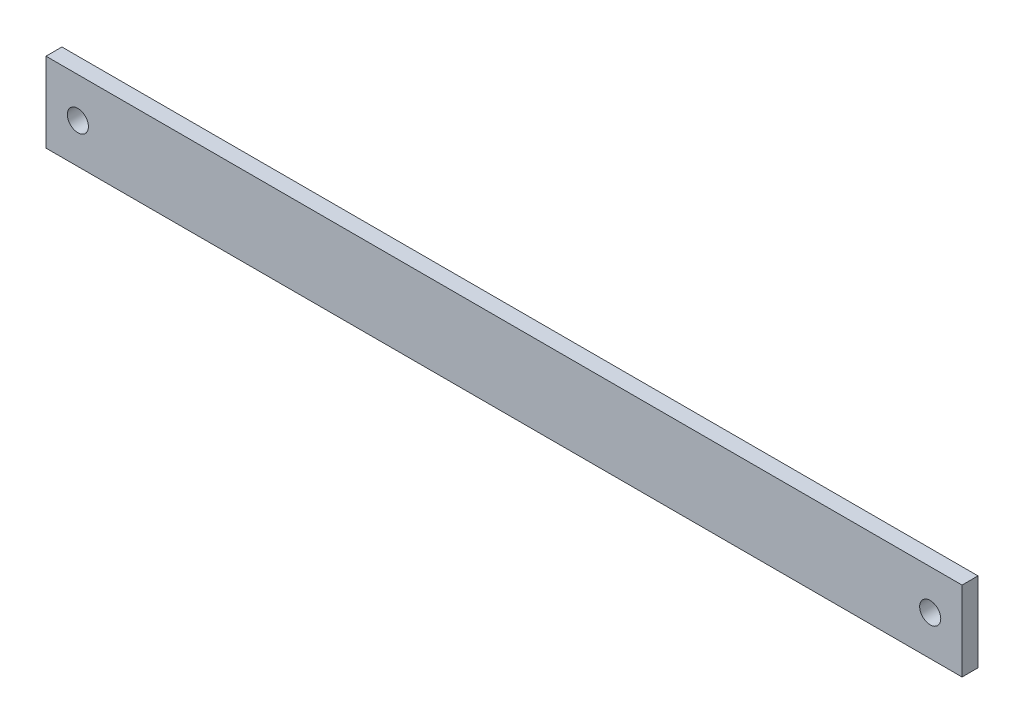
ISO-10303-21;
HEADER;
FILE_DESCRIPTION(('STEP AP214'),'2;1');
FILE_NAME('part.step','',(''),(''),'','','');
FILE_SCHEMA(('AUTOMOTIVE_DESIGN { 1 0 10303 214 1 1 1 1 }'));
ENDSEC;
DATA;
#1=APPLICATION_CONTEXT('core data for automotive mechanical design processes');
#2=APPLICATION_PROTOCOL_DEFINITION('international standard','automotive_design',2000,#1);
#3=PRODUCT_CONTEXT('',#1,'mechanical');
#4=PRODUCT('Part','Part','',(#3));
#5=PRODUCT_RELATED_PRODUCT_CATEGORY('part','',(#4));
#6=PRODUCT_DEFINITION_FORMATION('','',#4);
#7=PRODUCT_DEFINITION_CONTEXT('part definition',#1,'design');
#8=PRODUCT_DEFINITION('design','',#6,#7);
#9=PRODUCT_DEFINITION_SHAPE('','',#8);
#10=(LENGTH_UNIT() NAMED_UNIT(*) SI_UNIT(.MILLI.,.METRE.));
#11=(NAMED_UNIT(*) PLANE_ANGLE_UNIT() SI_UNIT($,.RADIAN.));
#12=(NAMED_UNIT(*) SI_UNIT($,.STERADIAN.) SOLID_ANGLE_UNIT());
#13=UNCERTAINTY_MEASURE_WITH_UNIT(LENGTH_MEASURE(1.E-05),#10,'distance_accuracy_value','');
#14=(GEOMETRIC_REPRESENTATION_CONTEXT(3) GLOBAL_UNCERTAINTY_ASSIGNED_CONTEXT((#13)) GLOBAL_UNIT_ASSIGNED_CONTEXT((#10,
#11,#12)) REPRESENTATION_CONTEXT('',''));
#15=CARTESIAN_POINT('',(0.,0.,0.));
#16=DIRECTION('',(0.,0.,1.));
#17=DIRECTION('',(1.,0.,0.));
#18=AXIS2_PLACEMENT_3D('',#15,#16,#17);
#19=CARTESIAN_POINT('',(0.,20.,-4.));
#20=DIRECTION('',(0.,1.,0.));
#21=DIRECTION('',(0.,0.,1.));
#22=AXIS2_PLACEMENT_3D('',#19,#20,#21);
#23=PLANE('',#22);
#24=DIRECTION('',(-1.,0.,0.));
#25=VECTOR('',#24,1.);
#26=CARTESIAN_POINT('',(0.,20.,0.));
#27=LINE('',#26,#25);
#28=CARTESIAN_POINT('',(230.,20.,0.));
#29=VERTEX_POINT('',#28);
#30=CARTESIAN_POINT('',(0.,20.,0.));
#31=VERTEX_POINT('',#30);
#32=EDGE_CURVE('E107',#29,#31,#27,.T.);
#33=ORIENTED_EDGE('',*,*,#32,.F.);
#34=DIRECTION('',(0.,0.,1.));
#35=VECTOR('',#34,1.);
#36=CARTESIAN_POINT('',(230.,20.,-4.));
#37=LINE('',#36,#35);
#38=CARTESIAN_POINT('',(230.,20.,-4.));
#39=VERTEX_POINT('',#38);
#40=EDGE_CURVE('E11',#39,#29,#37,.T.);
#41=ORIENTED_EDGE('',*,*,#40,.F.);
#42=DIRECTION('',(-1.,0.,0.));
#43=VECTOR('',#42,1.);
#44=CARTESIAN_POINT('',(0.,20.,-4.));
#45=LINE('',#44,#43);
#46=CARTESIAN_POINT('',(0.,20.,-4.));
#47=VERTEX_POINT('',#46);
#48=EDGE_CURVE('E100',#39,#47,#45,.T.);
#49=ORIENTED_EDGE('',*,*,#48,.T.);
#50=DIRECTION('',(0.,0.,1.));
#51=VECTOR('',#50,1.);
#52=CARTESIAN_POINT('',(0.,20.,-4.));
#53=LINE('',#52,#51);
#54=EDGE_CURVE('E44',#47,#31,#53,.T.);
#55=ORIENTED_EDGE('',*,*,#54,.T.);
#56=EDGE_LOOP('',(#33,#41,#49,#55));
#57=FACE_BOUND('',#56,.T.);
#58=ADVANCED_FACE('F41',(#57),#23,.T.);
#59=CARTESIAN_POINT('',(230.,20.,-4.));
#60=DIRECTION('',(1.,0.,0.));
#61=DIRECTION('',(0.,0.,-1.));
#62=AXIS2_PLACEMENT_3D('',#59,#60,#61);
#63=PLANE('',#62);
#64=DIRECTION('',(0.,1.,0.));
#65=VECTOR('',#64,1.);
#66=CARTESIAN_POINT('',(230.,20.,0.));
#67=LINE('',#66,#65);
#68=CARTESIAN_POINT('',(230.,0.,0.));
#69=VERTEX_POINT('',#68);
#70=EDGE_CURVE('E102',#69,#29,#67,.T.);
#71=ORIENTED_EDGE('',*,*,#70,.F.);
#72=DIRECTION('',(0.,0.,1.));
#73=VECTOR('',#72,1.);
#74=CARTESIAN_POINT('',(230.,0.,-4.));
#75=LINE('',#74,#73);
#76=CARTESIAN_POINT('',(230.,0.,-4.));
#77=VERTEX_POINT('',#76);
#78=EDGE_CURVE('E50',#77,#69,#75,.T.);
#79=ORIENTED_EDGE('',*,*,#78,.F.);
#80=DIRECTION('',(0.,1.,0.));
#81=VECTOR('',#80,1.);
#82=CARTESIAN_POINT('',(230.,20.,-4.));
#83=LINE('',#82,#81);
#84=EDGE_CURVE('E96',#77,#39,#83,.T.);
#85=ORIENTED_EDGE('',*,*,#84,.T.);
#86=ORIENTED_EDGE('',*,*,#40,.T.);
#87=EDGE_LOOP('',(#71,#79,#85,#86));
#88=FACE_BOUND('',#87,.T.);
#89=ADVANCED_FACE('F119',(#88),#63,.T.);
#90=CARTESIAN_POINT('',(0.,0.,-4.));
#91=DIRECTION('',(0.,-1.,0.));
#92=DIRECTION('',(0.,0.,-1.));
#93=AXIS2_PLACEMENT_3D('',#90,#91,#92);
#94=PLANE('',#93);
#95=DIRECTION('',(1.,0.,0.));
#96=VECTOR('',#95,1.);
#97=CARTESIAN_POINT('',(0.,0.,0.));
#98=LINE('',#97,#96);
#99=CARTESIAN_POINT('',(0.,0.,0.));
#100=VERTEX_POINT('',#99);
#101=EDGE_CURVE('E91',#100,#69,#98,.T.);
#102=ORIENTED_EDGE('',*,*,#101,.F.);
#103=DIRECTION('',(0.,0.,1.));
#104=VECTOR('',#103,1.);
#105=CARTESIAN_POINT('',(0.,0.,-4.));
#106=LINE('',#105,#104);
#107=CARTESIAN_POINT('',(0.,0.,-4.));
#108=VERTEX_POINT('',#107);
#109=EDGE_CURVE('E86',#108,#100,#106,.T.);
#110=ORIENTED_EDGE('',*,*,#109,.F.);
#111=DIRECTION('',(1.,0.,0.));
#112=VECTOR('',#111,1.);
#113=CARTESIAN_POINT('',(0.,0.,-4.));
#114=LINE('',#113,#112);
#115=EDGE_CURVE('E89',#108,#77,#114,.T.);
#116=ORIENTED_EDGE('',*,*,#115,.T.);
#117=ORIENTED_EDGE('',*,*,#78,.T.);
#118=EDGE_LOOP('',(#102,#110,#116,#117));
#119=FACE_BOUND('',#118,.T.);
#120=ADVANCED_FACE('F88',(#119),#94,.T.);
#121=CARTESIAN_POINT('',(0.,20.,-4.));
#122=DIRECTION('',(-1.,0.,0.));
#123=DIRECTION('',(0.,0.,1.));
#124=AXIS2_PLACEMENT_3D('',#121,#122,#123);
#125=PLANE('',#124);
#126=DIRECTION('',(0.,-1.,0.));
#127=VECTOR('',#126,1.);
#128=CARTESIAN_POINT('',(0.,20.,0.));
#129=LINE('',#128,#127);
#130=EDGE_CURVE('E110',#31,#100,#129,.T.);
#131=ORIENTED_EDGE('',*,*,#130,.F.);
#132=ORIENTED_EDGE('',*,*,#54,.F.);
#133=DIRECTION('',(0.,-1.,0.));
#134=VECTOR('',#133,1.);
#135=CARTESIAN_POINT('',(0.,20.,-4.));
#136=LINE('',#135,#134);
#137=EDGE_CURVE('E95',#47,#108,#136,.T.);
#138=ORIENTED_EDGE('',*,*,#137,.T.);
#139=ORIENTED_EDGE('',*,*,#109,.T.);
#140=EDGE_LOOP('',(#131,#132,#138,#139));
#141=FACE_BOUND('',#140,.T.);
#142=ADVANCED_FACE('F99',(#141),#125,.T.);
#143=CARTESIAN_POINT('',(0.,0.,-4.));
#144=DIRECTION('',(0.,0.,-1.));
#145=DIRECTION('',(-1.,0.,0.));
#146=AXIS2_PLACEMENT_3D('',#143,#144,#145);
#147=PLANE('',#146);
#148=CARTESIAN_POINT('',(222.,10.,-4.));
#149=DIRECTION('',(0.,0.,1.));
#150=DIRECTION('',(1.,0.,0.));
#151=AXIS2_PLACEMENT_3D('',#148,#149,#150);
#152=CIRCLE('',#151,2.65000000000001);
#153=CARTESIAN_POINT('',(224.65,10.,-4.));
#154=VERTEX_POINT('',#153);
#155=EDGE_CURVE('E152',#154,#154,#152,.T.);
#156=ORIENTED_EDGE('',*,*,#155,.T.);
#157=EDGE_LOOP('',(#156));
#158=FACE_BOUND('',#157,.T.);
#159=CARTESIAN_POINT('',(8.,10.,-4.));
#160=DIRECTION('',(0.,0.,1.));
#161=DIRECTION('',(1.,0.,0.));
#162=AXIS2_PLACEMENT_3D('',#159,#160,#161);
#163=CIRCLE('',#162,2.65);
#164=CARTESIAN_POINT('',(10.65,10.,-4.));
#165=VERTEX_POINT('',#164);
#166=EDGE_CURVE('E111',#165,#165,#163,.T.);
#167=ORIENTED_EDGE('',*,*,#166,.T.);
#168=EDGE_LOOP('',(#167));
#169=FACE_BOUND('',#168,.T.);
#170=ORIENTED_EDGE('',*,*,#48,.F.);
#171=ORIENTED_EDGE('',*,*,#84,.F.);
#172=ORIENTED_EDGE('',*,*,#115,.F.);
#173=ORIENTED_EDGE('',*,*,#137,.F.);
#174=EDGE_LOOP('',(#170,#171,#172,#173));
#175=FACE_BOUND('',#174,.T.);
#176=ADVANCED_FACE('F94',(#158,#169,#175),#147,.T.);
#177=CARTESIAN_POINT('',(0.,0.,0.));
#178=DIRECTION('',(0.,0.,-1.));
#179=DIRECTION('',(-1.,0.,0.));
#180=AXIS2_PLACEMENT_3D('',#177,#178,#179);
#181=PLANE('',#180);
#182=CARTESIAN_POINT('',(222.,10.,0.));
#183=DIRECTION('',(0.,0.,1.));
#184=DIRECTION('',(1.,0.,0.));
#185=AXIS2_PLACEMENT_3D('',#182,#183,#184);
#186=CIRCLE('',#185,2.65000000000001);
#187=CARTESIAN_POINT('',(224.65,10.,0.));
#188=VERTEX_POINT('',#187);
#189=EDGE_CURVE('E155',#188,#188,#186,.T.);
#190=ORIENTED_EDGE('',*,*,#189,.F.);
#191=EDGE_LOOP('',(#190));
#192=FACE_BOUND('',#191,.T.);
#193=CARTESIAN_POINT('',(8.,10.,0.));
#194=DIRECTION('',(0.,0.,1.));
#195=DIRECTION('',(1.,0.,0.));
#196=AXIS2_PLACEMENT_3D('',#193,#194,#195);
#197=CIRCLE('',#196,2.65);
#198=CARTESIAN_POINT('',(10.65,10.,0.));
#199=VERTEX_POINT('',#198);
#200=EDGE_CURVE('E157',#199,#199,#197,.T.);
#201=ORIENTED_EDGE('',*,*,#200,.F.);
#202=EDGE_LOOP('',(#201));
#203=FACE_BOUND('',#202,.T.);
#204=ORIENTED_EDGE('',*,*,#32,.T.);
#205=ORIENTED_EDGE('',*,*,#130,.T.);
#206=ORIENTED_EDGE('',*,*,#101,.T.);
#207=ORIENTED_EDGE('',*,*,#70,.T.);
#208=EDGE_LOOP('',(#204,#205,#206,#207));
#209=FACE_BOUND('',#208,.T.);
#210=ADVANCED_FACE('F118',(#192,#203,#209),#181,.F.);
#211=CARTESIAN_POINT('',(8.,10.,-4.));
#212=DIRECTION('',(0.,0.,1.));
#213=DIRECTION('',(1.,0.,0.));
#214=AXIS2_PLACEMENT_3D('',#211,#212,#213);
#215=CYLINDRICAL_SURFACE('',#214,2.65);
#216=ORIENTED_EDGE('',*,*,#166,.F.);
#217=EDGE_LOOP('',(#216));
#218=FACE_BOUND('',#217,.T.);
#219=ORIENTED_EDGE('',*,*,#200,.T.);
#220=EDGE_LOOP('',(#219));
#221=FACE_BOUND('',#220,.T.);
#222=ADVANCED_FACE('F137',(#218,#221),#215,.F.);
#223=CARTESIAN_POINT('',(222.,10.,-4.));
#224=DIRECTION('',(0.,0.,1.));
#225=DIRECTION('',(1.,0.,0.));
#226=AXIS2_PLACEMENT_3D('',#223,#224,#225);
#227=CYLINDRICAL_SURFACE('',#226,2.65000000000001);
#228=ORIENTED_EDGE('',*,*,#155,.F.);
#229=EDGE_LOOP('',(#228));
#230=FACE_BOUND('',#229,.T.);
#231=ORIENTED_EDGE('',*,*,#189,.T.);
#232=EDGE_LOOP('',(#231));
#233=FACE_BOUND('',#232,.T.);
#234=ADVANCED_FACE('F144',(#230,#233),#227,.F.);
#235=CLOSED_SHELL('',(#58,#89,#120,#142,#176,#210,#222,#234));
#236=MANIFOLD_SOLID_BREP('B2',#235);
#237=ADVANCED_BREP_SHAPE_REPRESENTATION('',(#18,#236),#14);
#238=SHAPE_DEFINITION_REPRESENTATION(#9,#237);
ENDSEC;
END-ISO-10303-21;
